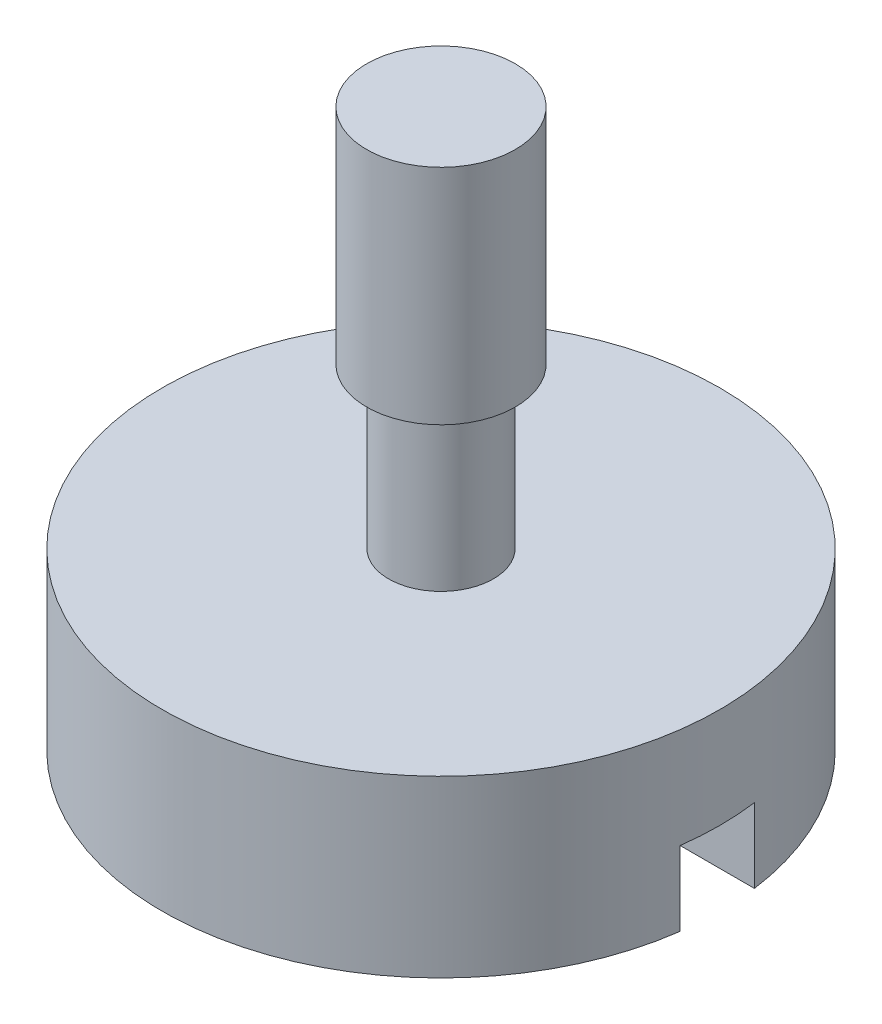
ISO-10303-21;
HEADER;
FILE_DESCRIPTION(('STEP AP214'),'2;1');
FILE_NAME('part.step','',(''),(''),'','','');
FILE_SCHEMA(('AUTOMOTIVE_DESIGN { 1 0 10303 214 1 1 1 1 }'));
ENDSEC;
DATA;
#1=APPLICATION_CONTEXT('core data for automotive mechanical design processes');
#2=APPLICATION_PROTOCOL_DEFINITION('international standard','automotive_design',2000,#1);
#3=PRODUCT_CONTEXT('',#1,'mechanical');
#4=PRODUCT('Part','Part','',(#3));
#5=PRODUCT_RELATED_PRODUCT_CATEGORY('part','',(#4));
#6=PRODUCT_DEFINITION_FORMATION('','',#4);
#7=PRODUCT_DEFINITION_CONTEXT('part definition',#1,'design');
#8=PRODUCT_DEFINITION('design','',#6,#7);
#9=PRODUCT_DEFINITION_SHAPE('','',#8);
#10=(LENGTH_UNIT() NAMED_UNIT(*) SI_UNIT(.MILLI.,.METRE.));
#11=(NAMED_UNIT(*) PLANE_ANGLE_UNIT() SI_UNIT($,.RADIAN.));
#12=(NAMED_UNIT(*) SI_UNIT($,.STERADIAN.) SOLID_ANGLE_UNIT());
#13=UNCERTAINTY_MEASURE_WITH_UNIT(LENGTH_MEASURE(1.E-05),#10,'distance_accuracy_value','');
#14=(GEOMETRIC_REPRESENTATION_CONTEXT(3) GLOBAL_UNCERTAINTY_ASSIGNED_CONTEXT((#13)) GLOBAL_UNIT_ASSIGNED_CONTEXT((#10,
#11,#12)) REPRESENTATION_CONTEXT('',''));
#15=CARTESIAN_POINT('',(0.,0.,0.));
#16=DIRECTION('',(0.,0.,1.));
#17=DIRECTION('',(1.,0.,0.));
#18=AXIS2_PLACEMENT_3D('',#15,#16,#17);
#19=CARTESIAN_POINT('',(7.5,0.,0.));
#20=DIRECTION('',(0.,-1.,0.));
#21=DIRECTION('',(0.,0.,-1.));
#22=AXIS2_PLACEMENT_3D('',#19,#20,#21);
#23=PLANE('',#22);
#24=DIRECTION('',(1.,0.,0.));
#25=VECTOR('',#24,1.);
#26=CARTESIAN_POINT('',(7.5,0.,-1.));
#27=LINE('',#26,#25);
#28=CARTESIAN_POINT('',(-7.43303437365925,0.,-1.));
#29=VERTEX_POINT('',#28);
#30=CARTESIAN_POINT('',(7.43303437365925,0.,-1.));
#31=VERTEX_POINT('',#30);
#32=EDGE_CURVE('E96',#29,#31,#27,.T.);
#33=ORIENTED_EDGE('',*,*,#32,.F.);
#34=CARTESIAN_POINT('',(0.,0.,0.));
#35=DIRECTION('',(0.,-1.,0.));
#36=DIRECTION('',(0.,0.,-1.));
#37=AXIS2_PLACEMENT_3D('',#34,#35,#36);
#38=CIRCLE('',#37,7.5);
#39=EDGE_CURVE('E110',#29,#31,#38,.T.);
#40=ORIENTED_EDGE('',*,*,#39,.T.);
#41=EDGE_LOOP('',(#33,#40));
#42=FACE_BOUND('',#41,.T.);
#43=ADVANCED_FACE('F38',(#42),#23,.T.);
#44=CARTESIAN_POINT('',(0.,15.,0.));
#45=DIRECTION('',(0.,1.,0.));
#46=DIRECTION('',(0.,0.,1.));
#47=AXIS2_PLACEMENT_3D('',#44,#45,#46);
#48=PLANE('',#47);
#49=CARTESIAN_POINT('',(0.,15.,0.));
#50=DIRECTION('',(0.,-1.,0.));
#51=DIRECTION('',(0.,0.,-1.));
#52=AXIS2_PLACEMENT_3D('',#49,#50,#51);
#53=CIRCLE('',#52,2.);
#54=CARTESIAN_POINT('',(0.,15.,-2.));
#55=VERTEX_POINT('',#54);
#56=EDGE_CURVE('E97',#55,#55,#53,.T.);
#57=ORIENTED_EDGE('',*,*,#56,.F.);
#58=EDGE_LOOP('',(#57));
#59=FACE_BOUND('',#58,.T.);
#60=ADVANCED_FACE('F40',(#59),#48,.T.);
#61=CARTESIAN_POINT('',(0.,-3.57829225234083,0.));
#62=DIRECTION('',(0.,-1.,0.));
#63=DIRECTION('',(0.,0.,-1.));
#64=AXIS2_PLACEMENT_3D('',#61,#62,#63);
#65=CYLINDRICAL_SURFACE('',#64,2.);
#66=ORIENTED_EDGE('',*,*,#56,.T.);
#67=EDGE_LOOP('',(#66));
#68=FACE_BOUND('',#67,.T.);
#69=CARTESIAN_POINT('',(0.,9.,0.));
#70=DIRECTION('',(0.,-1.,0.));
#71=DIRECTION('',(0.,0.,-1.));
#72=AXIS2_PLACEMENT_3D('',#69,#70,#71);
#73=CIRCLE('',#72,2.);
#74=CARTESIAN_POINT('',(0.,9.,-2.));
#75=VERTEX_POINT('',#74);
#76=EDGE_CURVE('E129',#75,#75,#73,.T.);
#77=ORIENTED_EDGE('',*,*,#76,.F.);
#78=EDGE_LOOP('',(#77));
#79=FACE_BOUND('',#78,.T.);
#80=ADVANCED_FACE('F158',(#68,#79),#65,.T.);
#81=CARTESIAN_POINT('',(2.,9.,0.));
#82=DIRECTION('',(0.,-1.,0.));
#83=DIRECTION('',(0.,0.,-1.));
#84=AXIS2_PLACEMENT_3D('',#81,#82,#83);
#85=PLANE('',#84);
#86=ORIENTED_EDGE('',*,*,#76,.T.);
#87=EDGE_LOOP('',(#86));
#88=FACE_BOUND('',#87,.T.);
#89=CARTESIAN_POINT('',(0.,9.,0.));
#90=DIRECTION('',(0.,-1.,0.));
#91=DIRECTION('',(0.,0.,-1.));
#92=AXIS2_PLACEMENT_3D('',#89,#90,#91);
#93=CIRCLE('',#92,1.40953383748865);
#94=CARTESIAN_POINT('',(0.,9.,-1.40953383748865));
#95=VERTEX_POINT('',#94);
#96=EDGE_CURVE('E125',#95,#95,#93,.T.);
#97=ORIENTED_EDGE('',*,*,#96,.F.);
#98=EDGE_LOOP('',(#97));
#99=FACE_BOUND('',#98,.T.);
#100=ADVANCED_FACE('F178',(#88,#99),#85,.T.);
#101=CARTESIAN_POINT('',(0.,-3.57829225234083,0.));
#102=DIRECTION('',(0.,-1.,0.));
#103=DIRECTION('',(0.,0.,-1.));
#104=AXIS2_PLACEMENT_3D('',#101,#102,#103);
#105=CYLINDRICAL_SURFACE('',#104,1.40953383748865);
#106=ORIENTED_EDGE('',*,*,#96,.T.);
#107=EDGE_LOOP('',(#106));
#108=FACE_BOUND('',#107,.T.);
#109=CARTESIAN_POINT('',(0.,4.7,0.));
#110=DIRECTION('',(0.,-1.,0.));
#111=DIRECTION('',(0.,0.,-1.));
#112=AXIS2_PLACEMENT_3D('',#109,#110,#111);
#113=CIRCLE('',#112,1.40953383748865);
#114=CARTESIAN_POINT('',(0.,4.7,-1.40953383748865));
#115=VERTEX_POINT('',#114);
#116=EDGE_CURVE('E115',#115,#115,#113,.T.);
#117=ORIENTED_EDGE('',*,*,#116,.F.);
#118=EDGE_LOOP('',(#117));
#119=FACE_BOUND('',#118,.T.);
#120=ADVANCED_FACE('F172',(#108,#119),#105,.T.);
#121=CARTESIAN_POINT('',(1.40953383748865,4.7,0.));
#122=DIRECTION('',(0.,1.,0.));
#123=DIRECTION('',(0.,0.,1.));
#124=AXIS2_PLACEMENT_3D('',#121,#122,#123);
#125=PLANE('',#124);
#126=ORIENTED_EDGE('',*,*,#116,.T.);
#127=EDGE_LOOP('',(#126));
#128=FACE_BOUND('',#127,.T.);
#129=CARTESIAN_POINT('',(0.,4.7,0.));
#130=DIRECTION('',(0.,-1.,0.));
#131=DIRECTION('',(0.,0.,-1.));
#132=AXIS2_PLACEMENT_3D('',#129,#130,#131);
#133=CIRCLE('',#132,7.5);
#134=CARTESIAN_POINT('',(0.,4.7,-7.5));
#135=VERTEX_POINT('',#134);
#136=EDGE_CURVE('E109',#135,#135,#133,.T.);
#137=ORIENTED_EDGE('',*,*,#136,.F.);
#138=EDGE_LOOP('',(#137));
#139=FACE_BOUND('',#138,.T.);
#140=ADVANCED_FACE('F168',(#128,#139),#125,.T.);
#141=CARTESIAN_POINT('',(0.,-3.57829225234083,0.));
#142=DIRECTION('',(0.,-1.,0.));
#143=DIRECTION('',(0.,0.,-1.));
#144=AXIS2_PLACEMENT_3D('',#141,#142,#143);
#145=CYLINDRICAL_SURFACE('',#144,7.5);
#146=DIRECTION('',(0.,-1.,0.));
#147=VECTOR('',#146,1.);
#148=CARTESIAN_POINT('',(-7.43303437365925,-3.57829225234083,-1.));
#149=LINE('',#148,#147);
#150=CARTESIAN_POINT('',(-7.43303437365925,2.,-1.));
#151=VERTEX_POINT('',#150);
#152=EDGE_CURVE('E105',#151,#29,#149,.T.);
#153=ORIENTED_EDGE('',*,*,#152,.F.);
#154=CARTESIAN_POINT('',(0.,2.,0.));
#155=DIRECTION('',(0.,-1.,0.));
#156=DIRECTION('',(0.,0.,-1.));
#157=AXIS2_PLACEMENT_3D('',#154,#155,#156);
#158=CIRCLE('',#157,7.5);
#159=CARTESIAN_POINT('',(-7.43303437365925,2.,1.));
#160=VERTEX_POINT('',#159);
#161=EDGE_CURVE('E11',#151,#160,#158,.F.);
#162=ORIENTED_EDGE('',*,*,#161,.T.);
#163=DIRECTION('',(0.,-1.,0.));
#164=VECTOR('',#163,1.);
#165=CARTESIAN_POINT('',(-7.43303437365925,-3.57829225234083,1.));
#166=LINE('',#165,#164);
#167=CARTESIAN_POINT('',(-7.43303437365925,0.,1.));
#168=VERTEX_POINT('',#167);
#169=EDGE_CURVE('E90',#168,#160,#166,.F.);
#170=ORIENTED_EDGE('',*,*,#169,.F.);
#171=CARTESIAN_POINT('',(7.43303437365925,0.,1.));
#172=VERTEX_POINT('',#171);
#173=EDGE_CURVE('E103',#172,#168,#38,.T.);
#174=ORIENTED_EDGE('',*,*,#173,.F.);
#175=DIRECTION('',(0.,-1.,0.));
#176=VECTOR('',#175,1.);
#177=CARTESIAN_POINT('',(7.43303437365925,-3.57829225234083,1.));
#178=LINE('',#177,#176);
#179=CARTESIAN_POINT('',(7.43303437365925,2.,1.));
#180=VERTEX_POINT('',#179);
#181=EDGE_CURVE('E56',#180,#172,#178,.T.);
#182=ORIENTED_EDGE('',*,*,#181,.F.);
#183=CARTESIAN_POINT('',(7.43303437365925,2.,-1.));
#184=VERTEX_POINT('',#183);
#185=EDGE_CURVE('E42',#180,#184,#158,.F.);
#186=ORIENTED_EDGE('',*,*,#185,.T.);
#187=DIRECTION('',(0.,-1.,0.));
#188=VECTOR('',#187,1.);
#189=CARTESIAN_POINT('',(7.43303437365925,-3.57829225234083,-1.));
#190=LINE('',#189,#188);
#191=EDGE_CURVE('E67',#31,#184,#190,.F.);
#192=ORIENTED_EDGE('',*,*,#191,.F.);
#193=ORIENTED_EDGE('',*,*,#39,.F.);
#194=EDGE_LOOP('',(#153,#162,#170,#174,#182,#186,#192,#193));
#195=FACE_BOUND('',#194,.T.);
#196=ORIENTED_EDGE('',*,*,#136,.T.);
#197=EDGE_LOOP('',(#196));
#198=FACE_BOUND('',#197,.T.);
#199=ADVANCED_FACE('F101',(#195,#198),#145,.T.);
#200=DIRECTION('',(-1.,0.,0.));
#201=VECTOR('',#200,1.);
#202=CARTESIAN_POINT('',(7.5,0.,1.));
#203=LINE('',#202,#201);
#204=EDGE_CURVE('E87',#172,#168,#203,.T.);
#205=ORIENTED_EDGE('',*,*,#204,.F.);
#206=ORIENTED_EDGE('',*,*,#173,.T.);
#207=EDGE_LOOP('',(#205,#206));
#208=FACE_BOUND('',#207,.T.);
#209=ADVANCED_FACE('F107',(#208),#23,.T.);
#210=CARTESIAN_POINT('',(-10.0577952546729,2.,-1.));
#211=DIRECTION('',(0.,0.,-1.));
#212=DIRECTION('',(-1.,0.,0.));
#213=AXIS2_PLACEMENT_3D('',#210,#211,#212);
#214=PLANE('',#213);
#215=ORIENTED_EDGE('',*,*,#191,.T.);
#216=DIRECTION('',(1.,0.,0.));
#217=VECTOR('',#216,1.);
#218=CARTESIAN_POINT('',(-10.0577952546729,2.,-1.));
#219=LINE('',#218,#217);
#220=EDGE_CURVE('E145',#151,#184,#219,.T.);
#221=ORIENTED_EDGE('',*,*,#220,.F.);
#222=ORIENTED_EDGE('',*,*,#152,.T.);
#223=ORIENTED_EDGE('',*,*,#32,.T.);
#224=EDGE_LOOP('',(#215,#221,#222,#223));
#225=FACE_BOUND('',#224,.T.);
#226=ADVANCED_FACE('F151',(#225),#214,.F.);
#227=CARTESIAN_POINT('',(-10.0577952546729,2.,1.));
#228=DIRECTION('',(0.,0.,1.));
#229=DIRECTION('',(1.,0.,0.));
#230=AXIS2_PLACEMENT_3D('',#227,#228,#229);
#231=PLANE('',#230);
#232=ORIENTED_EDGE('',*,*,#169,.T.);
#233=DIRECTION('',(-1.,0.,0.));
#234=VECTOR('',#233,1.);
#235=CARTESIAN_POINT('',(-10.0577952546729,2.,1.));
#236=LINE('',#235,#234);
#237=EDGE_CURVE('E144',#180,#160,#236,.T.);
#238=ORIENTED_EDGE('',*,*,#237,.F.);
#239=ORIENTED_EDGE('',*,*,#181,.T.);
#240=ORIENTED_EDGE('',*,*,#204,.T.);
#241=EDGE_LOOP('',(#232,#238,#239,#240));
#242=FACE_BOUND('',#241,.T.);
#243=ADVANCED_FACE('F89',(#242),#231,.F.);
#244=CARTESIAN_POINT('',(0.,2.,0.));
#245=DIRECTION('',(0.,-1.,0.));
#246=DIRECTION('',(0.,0.,-1.));
#247=AXIS2_PLACEMENT_3D('',#244,#245,#246);
#248=PLANE('',#247);
#249=ORIENTED_EDGE('',*,*,#220,.T.);
#250=ORIENTED_EDGE('',*,*,#185,.F.);
#251=ORIENTED_EDGE('',*,*,#237,.T.);
#252=ORIENTED_EDGE('',*,*,#161,.F.);
#253=EDGE_LOOP('',(#249,#250,#251,#252));
#254=FACE_BOUND('',#253,.T.);
#255=ADVANCED_FACE('F143',(#254),#248,.T.);
#256=CLOSED_SHELL('',(#43,#60,#80,#100,#120,#140,#199,#209,#226,#243,#255));
#257=MANIFOLD_SOLID_BREP('B2',#256);
#258=ADVANCED_BREP_SHAPE_REPRESENTATION('',(#18,#257),#14);
#259=SHAPE_DEFINITION_REPRESENTATION(#9,#258);
ENDSEC;
END-ISO-10303-21;
